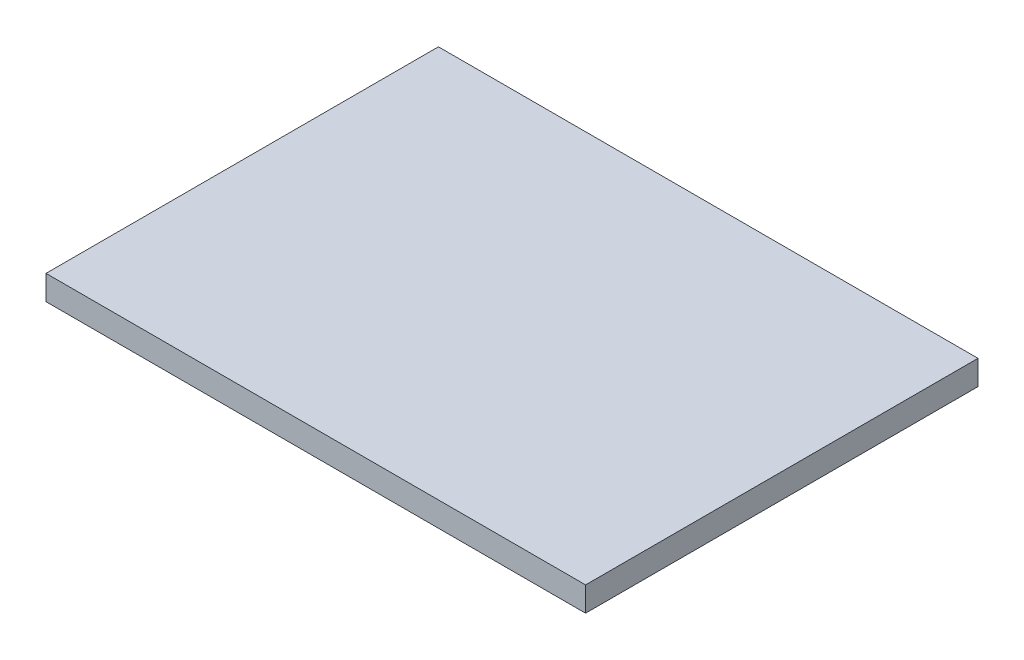
ISO-10303-21;
HEADER;
FILE_DESCRIPTION(('STEP AP214'),'2;1');
FILE_NAME('part.step','',(''),(''),'','','');
FILE_SCHEMA(('AUTOMOTIVE_DESIGN { 1 0 10303 214 1 1 1 1 }'));
ENDSEC;
DATA;
#1=APPLICATION_CONTEXT('core data for automotive mechanical design processes');
#2=APPLICATION_PROTOCOL_DEFINITION('international standard','automotive_design',2000,#1);
#3=PRODUCT_CONTEXT('',#1,'mechanical');
#4=PRODUCT('Part','Part','',(#3));
#5=PRODUCT_RELATED_PRODUCT_CATEGORY('part','',(#4));
#6=PRODUCT_DEFINITION_FORMATION('','',#4);
#7=PRODUCT_DEFINITION_CONTEXT('part definition',#1,'design');
#8=PRODUCT_DEFINITION('design','',#6,#7);
#9=PRODUCT_DEFINITION_SHAPE('','',#8);
#10=(LENGTH_UNIT() NAMED_UNIT(*) SI_UNIT(.MILLI.,.METRE.));
#11=(NAMED_UNIT(*) PLANE_ANGLE_UNIT() SI_UNIT($,.RADIAN.));
#12=(NAMED_UNIT(*) SI_UNIT($,.STERADIAN.) SOLID_ANGLE_UNIT());
#13=UNCERTAINTY_MEASURE_WITH_UNIT(LENGTH_MEASURE(1.E-05),#10,'distance_accuracy_value','');
#14=(GEOMETRIC_REPRESENTATION_CONTEXT(3) GLOBAL_UNCERTAINTY_ASSIGNED_CONTEXT((#13)) GLOBAL_UNIT_ASSIGNED_CONTEXT((#10,
#11,#12)) REPRESENTATION_CONTEXT('',''));
#15=CARTESIAN_POINT('',(0.,0.,0.));
#16=DIRECTION('',(0.,0.,1.));
#17=DIRECTION('',(1.,0.,0.));
#18=AXIS2_PLACEMENT_3D('',#15,#16,#17);
#19=CARTESIAN_POINT('',(-4.5793390229059,3.5256,6.623));
#20=DIRECTION('',(0.,0.,-1.));
#21=DIRECTION('',(-1.,0.,0.));
#22=AXIS2_PLACEMENT_3D('',#19,#20,#21);
#23=PLANE('',#22);
#24=DIRECTION('',(0.,-1.,0.));
#25=VECTOR('',#24,1.);
#26=CARTESIAN_POINT('',(-5.3809,3.5256,6.623));
#27=LINE('',#26,#25);
#28=CARTESIAN_POINT('',(-5.3809,3.5256,6.623));
#29=VERTEX_POINT('',#28);
#30=CARTESIAN_POINT('',(-5.3809,3.4756,6.623));
#31=VERTEX_POINT('',#30);
#32=EDGE_CURVE('E11',#29,#31,#27,.T.);
#33=ORIENTED_EDGE('',*,*,#32,.F.);
#34=DIRECTION('',(-1.,0.,0.));
#35=VECTOR('',#34,1.);
#36=CARTESIAN_POINT('',(-4.5793390229059,3.5256,6.623));
#37=LINE('',#36,#35);
#38=CARTESIAN_POINT('',(-6.4809,3.5256,6.623));
#39=VERTEX_POINT('',#38);
#40=EDGE_CURVE('E24',#29,#39,#37,.T.);
#41=ORIENTED_EDGE('',*,*,#40,.T.);
#42=DIRECTION('',(0.,-1.,0.));
#43=VECTOR('',#42,1.);
#44=CARTESIAN_POINT('',(-6.4809,3.5256,6.623));
#45=LINE('',#44,#43);
#46=CARTESIAN_POINT('',(-6.4809,3.4756,6.623));
#47=VERTEX_POINT('',#46);
#48=EDGE_CURVE('E75',#39,#47,#45,.T.);
#49=ORIENTED_EDGE('',*,*,#48,.T.);
#50=DIRECTION('',(-1.,0.,0.));
#51=VECTOR('',#50,1.);
#52=CARTESIAN_POINT('',(-4.5793390229059,3.4756,6.623));
#53=LINE('',#52,#51);
#54=EDGE_CURVE('E85',#31,#47,#53,.T.);
#55=ORIENTED_EDGE('',*,*,#54,.F.);
#56=EDGE_LOOP('',(#33,#41,#49,#55));
#57=FACE_BOUND('',#56,.T.);
#58=ADVANCED_FACE('F17',(#57),#23,.F.);
#59=CARTESIAN_POINT('',(-4.5793390229059,3.4756,6.623));
#60=DIRECTION('',(0.,1.,0.));
#61=DIRECTION('',(-1.,0.,0.));
#62=AXIS2_PLACEMENT_3D('',#59,#60,#61);
#63=PLANE('',#62);
#64=DIRECTION('',(0.,0.,-1.));
#65=VECTOR('',#64,1.);
#66=CARTESIAN_POINT('',(-5.3809,3.4756,6.623));
#67=LINE('',#66,#65);
#68=CARTESIAN_POINT('',(-5.3809,3.4756,5.823));
#69=VERTEX_POINT('',#68);
#70=EDGE_CURVE('E83',#31,#69,#67,.T.);
#71=ORIENTED_EDGE('',*,*,#70,.F.);
#72=ORIENTED_EDGE('',*,*,#54,.T.);
#73=DIRECTION('',(0.,0.,-1.));
#74=VECTOR('',#73,1.);
#75=CARTESIAN_POINT('',(-6.4809,3.4756,6.623));
#76=LINE('',#75,#74);
#77=CARTESIAN_POINT('',(-6.4809,3.4756,5.823));
#78=VERTEX_POINT('',#77);
#79=EDGE_CURVE('E81',#47,#78,#76,.T.);
#80=ORIENTED_EDGE('',*,*,#79,.T.);
#81=DIRECTION('',(-1.,0.,0.));
#82=VECTOR('',#81,1.);
#83=CARTESIAN_POINT('',(-4.5793390229059,3.4756,5.823));
#84=LINE('',#83,#82);
#85=EDGE_CURVE('E61',#69,#78,#84,.T.);
#86=ORIENTED_EDGE('',*,*,#85,.F.);
#87=EDGE_LOOP('',(#71,#72,#80,#86));
#88=FACE_BOUND('',#87,.T.);
#89=ADVANCED_FACE('F91',(#88),#63,.F.);
#90=CARTESIAN_POINT('',(-4.5793390229059,3.5256,5.823));
#91=DIRECTION('',(0.,0.,1.));
#92=DIRECTION('',(1.,0.,0.));
#93=AXIS2_PLACEMENT_3D('',#90,#91,#92);
#94=PLANE('',#93);
#95=DIRECTION('',(0.,1.,0.));
#96=VECTOR('',#95,1.);
#97=CARTESIAN_POINT('',(-5.3809,3.5256,5.823));
#98=LINE('',#97,#96);
#99=CARTESIAN_POINT('',(-5.3809,3.5256,5.823));
#100=VERTEX_POINT('',#99);
#101=EDGE_CURVE('E65',#69,#100,#98,.T.);
#102=ORIENTED_EDGE('',*,*,#101,.F.);
#103=ORIENTED_EDGE('',*,*,#85,.T.);
#104=DIRECTION('',(0.,1.,0.));
#105=VECTOR('',#104,1.);
#106=CARTESIAN_POINT('',(-6.4809,3.5256,5.823));
#107=LINE('',#106,#105);
#108=CARTESIAN_POINT('',(-6.4809,3.5256,5.823));
#109=VERTEX_POINT('',#108);
#110=EDGE_CURVE('E54',#78,#109,#107,.T.);
#111=ORIENTED_EDGE('',*,*,#110,.T.);
#112=DIRECTION('',(-1.,0.,0.));
#113=VECTOR('',#112,1.);
#114=CARTESIAN_POINT('',(-4.5793390229059,3.5256,5.823));
#115=LINE('',#114,#113);
#116=EDGE_CURVE('E58',#100,#109,#115,.T.);
#117=ORIENTED_EDGE('',*,*,#116,.F.);
#118=EDGE_LOOP('',(#102,#103,#111,#117));
#119=FACE_BOUND('',#118,.T.);
#120=ADVANCED_FACE('F57',(#119),#94,.F.);
#121=CARTESIAN_POINT('',(-4.5793390229059,3.5256,6.623));
#122=DIRECTION('',(0.,-1.,0.));
#123=DIRECTION('',(1.,0.,0.));
#124=AXIS2_PLACEMENT_3D('',#121,#122,#123);
#125=PLANE('',#124);
#126=DIRECTION('',(0.,0.,1.));
#127=VECTOR('',#126,1.);
#128=CARTESIAN_POINT('',(-5.3809,3.5256,6.623));
#129=LINE('',#128,#127);
#130=EDGE_CURVE('E71',#100,#29,#129,.T.);
#131=ORIENTED_EDGE('',*,*,#130,.F.);
#132=ORIENTED_EDGE('',*,*,#116,.T.);
#133=DIRECTION('',(0.,0.,1.));
#134=VECTOR('',#133,1.);
#135=CARTESIAN_POINT('',(-6.4809,3.5256,6.623));
#136=LINE('',#135,#134);
#137=EDGE_CURVE('E70',#109,#39,#136,.T.);
#138=ORIENTED_EDGE('',*,*,#137,.T.);
#139=ORIENTED_EDGE('',*,*,#40,.F.);
#140=EDGE_LOOP('',(#131,#132,#138,#139));
#141=FACE_BOUND('',#140,.T.);
#142=ADVANCED_FACE('F69',(#141),#125,.F.);
#143=CARTESIAN_POINT('',(-6.4809,3.4756,6.623));
#144=DIRECTION('',(1.,0.,0.));
#145=DIRECTION('',(0.,0.,-1.));
#146=AXIS2_PLACEMENT_3D('',#143,#144,#145);
#147=PLANE('',#146);
#148=ORIENTED_EDGE('',*,*,#48,.F.);
#149=ORIENTED_EDGE('',*,*,#137,.F.);
#150=ORIENTED_EDGE('',*,*,#110,.F.);
#151=ORIENTED_EDGE('',*,*,#79,.F.);
#152=EDGE_LOOP('',(#148,#149,#150,#151));
#153=FACE_BOUND('',#152,.T.);
#154=ADVANCED_FACE('F74',(#153),#147,.F.);
#155=CARTESIAN_POINT('',(-5.3809,3.5256,6.623));
#156=DIRECTION('',(1.,0.,0.));
#157=DIRECTION('',(0.,0.,1.));
#158=AXIS2_PLACEMENT_3D('',#155,#156,#157);
#159=PLANE('',#158);
#160=ORIENTED_EDGE('',*,*,#130,.T.);
#161=ORIENTED_EDGE('',*,*,#32,.T.);
#162=ORIENTED_EDGE('',*,*,#70,.T.);
#163=ORIENTED_EDGE('',*,*,#101,.T.);
#164=EDGE_LOOP('',(#160,#161,#162,#163));
#165=FACE_BOUND('',#164,.T.);
#166=ADVANCED_FACE('F88',(#165),#159,.T.);
#167=CLOSED_SHELL('',(#58,#89,#120,#142,#154,#166));
#168=MANIFOLD_SOLID_BREP('B1',#167);
#169=ADVANCED_BREP_SHAPE_REPRESENTATION('',(#18,#168),#14);
#170=SHAPE_DEFINITION_REPRESENTATION(#9,#169);
ENDSEC;
END-ISO-10303-21;
